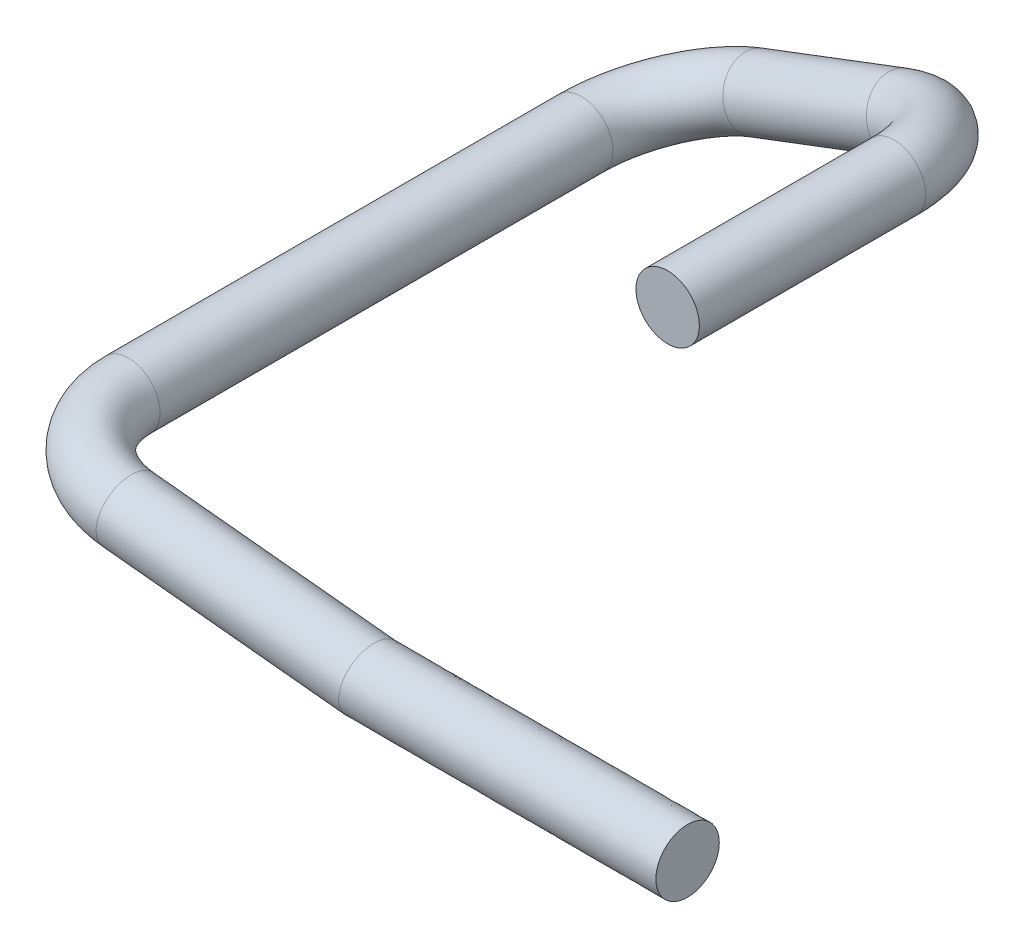
ISO-10303-21;
HEADER;
FILE_DESCRIPTION(('STEP AP214'),'2;1');
FILE_NAME('part.step','',(''),(''),'','','');
FILE_SCHEMA(('AUTOMOTIVE_DESIGN { 1 0 10303 214 1 1 1 1 }'));
ENDSEC;
DATA;
#1=APPLICATION_CONTEXT('core data for automotive mechanical design processes');
#2=APPLICATION_PROTOCOL_DEFINITION('international standard','automotive_design',2000,#1);
#3=PRODUCT_CONTEXT('',#1,'mechanical');
#4=PRODUCT('Part','Part','',(#3));
#5=PRODUCT_RELATED_PRODUCT_CATEGORY('part','',(#4));
#6=PRODUCT_DEFINITION_FORMATION('','',#4);
#7=PRODUCT_DEFINITION_CONTEXT('part definition',#1,'design');
#8=PRODUCT_DEFINITION('design','',#6,#7);
#9=PRODUCT_DEFINITION_SHAPE('','',#8);
#10=(LENGTH_UNIT() NAMED_UNIT(*) SI_UNIT(.MILLI.,.METRE.));
#11=(NAMED_UNIT(*) PLANE_ANGLE_UNIT() SI_UNIT($,.RADIAN.));
#12=(NAMED_UNIT(*) SI_UNIT($,.STERADIAN.) SOLID_ANGLE_UNIT());
#13=UNCERTAINTY_MEASURE_WITH_UNIT(LENGTH_MEASURE(1.E-05),#10,'distance_accuracy_value','');
#14=(GEOMETRIC_REPRESENTATION_CONTEXT(3) GLOBAL_UNCERTAINTY_ASSIGNED_CONTEXT((#13)) GLOBAL_UNIT_ASSIGNED_CONTEXT((#10,
#11,#12)) REPRESENTATION_CONTEXT('',''));
#15=CARTESIAN_POINT('',(0.,0.,0.));
#16=DIRECTION('',(0.,0.,1.));
#17=DIRECTION('',(1.,0.,0.));
#18=AXIS2_PLACEMENT_3D('',#15,#16,#17);
#19=CARTESIAN_POINT('',(6.27851787087894,1.68232379316639,0.));
#20=DIRECTION('',(0.,0.,-1.));
#21=DIRECTION('',(-1.,0.,0.));
#22=AXIS2_PLACEMENT_3D('',#19,#20,#21);
#23=PLANE('',#22);
#24=CARTESIAN_POINT('',(6.27851787087895,1.68232379316639,0.));
#25=DIRECTION('',(0.,0.,1.));
#26=DIRECTION('',(1.,0.,0.));
#27=AXIS2_PLACEMENT_3D('',#24,#25,#26);
#28=CIRCLE('',#27,0.35);
#29=CARTESIAN_POINT('',(6.62851787087895,1.68232379316639,0.));
#30=VERTEX_POINT('',#29);
#31=EDGE_CURVE('E20',#30,#30,#28,.F.);
#32=ORIENTED_EDGE('',*,*,#31,.F.);
#33=EDGE_LOOP('',(#32));
#34=FACE_BOUND('',#33,.T.);
#35=ADVANCED_FACE('F17',(#34),#23,.F.);
#36=CARTESIAN_POINT('',(9.99853230540907,0.505486251141968,3.50000000000001));
#37=DIRECTION('',(-1.,0.,0.));
#38=DIRECTION('',(0.,-1.,0.));
#39=AXIS2_PLACEMENT_3D('',#36,#37,#38);
#40=PLANE('',#39);
#41=CARTESIAN_POINT('',(9.99853230540907,0.,3.15));
#42=CARTESIAN_POINT('',(9.99853230540907,0.0195010104754725,3.14999791433196));
#43=CARTESIAN_POINT('',(9.99853230540907,0.0389894159101418,3.15164876658749));
#44=CARTESIAN_POINT('',(9.99853230540907,0.0774422300209664,3.15820290086756));
#45=CARTESIAN_POINT('',(9.99853230540907,0.0964059788181869,3.16311010061271));
#46=CARTESIAN_POINT('',(9.99853230540907,0.133212037516688,3.17603049641166));
#47=CARTESIAN_POINT('',(9.99853230540907,0.151055878771493,3.18403933880923));
#48=CARTESIAN_POINT('',(9.99853230540907,0.185175285188063,3.20294365652747));
#49=CARTESIAN_POINT('',(9.99853230540907,0.201448634547477,3.21384313131243));
#50=CARTESIAN_POINT('',(9.99853230540907,0.231956555902356,3.23822018103652));
#51=CARTESIAN_POINT('',(9.99853230540907,0.246189327358212,3.25170000860563));
#52=CARTESIAN_POINT('',(9.99853230540907,0.272223156435592,3.2808667429134));
#53=CARTESIAN_POINT('',(9.99853230540907,0.284020737221165,3.29655675222784));
#54=CARTESIAN_POINT('',(9.99853230540907,0.304869666365977,3.32974077120666));
#55=CARTESIAN_POINT('',(9.99853230540907,0.313911505979086,3.34724075421556));
#56=CARTESIAN_POINT('',(9.99853230540907,0.328956835362531,3.38353024989307));
#57=CARTESIAN_POINT('',(9.99853230540907,0.334955983776566,3.40232156191391));
#58=CARTESIAN_POINT('',(9.99853230540907,0.343746415563995,3.44070197741495));
#59=CARTESIAN_POINT('',(9.99853230540907,0.346527605339234,3.46029339267179));
#60=CARTESIAN_POINT('',(9.99853230540907,0.348773563920627,3.49969321275048));
#61=CARTESIAN_POINT('',(9.99853230540907,0.348233633861516,3.5195018854134));
#62=CARTESIAN_POINT('',(9.99853230540907,0.343839242257914,3.55876578864535));
#63=CARTESIAN_POINT('',(9.99853230540907,0.339981878984668,3.57822069456082));
#64=CARTESIAN_POINT('',(9.99853230540907,0.329047095330254,3.61623344745642));
#65=CARTESIAN_POINT('',(9.99853230540907,0.321965176151373,3.63479000093293));
#66=CARTESIAN_POINT('',(9.99853230540907,0.304797141257798,3.67040264474921));
#67=CARTESIAN_POINT('',(9.99853230540907,0.29471822093196,3.68746220353669));
#68=CARTESIAN_POINT('',(9.99853230540907,0.271814642988014,3.71966276067401));
#69=CARTESIAN_POINT('',(9.99853230540907,0.258986210415145,3.73480107528321));
#70=CARTESIAN_POINT('',(9.99853230540907,0.231027521197731,3.76261769462048));
#71=CARTESIAN_POINT('',(9.99853230540907,0.215909633304269,3.77530843157852));
#72=CARTESIAN_POINT('',(9.99853230540907,0.183727247644966,3.79797454247422));
#73=CARTESIAN_POINT('',(9.99853230540907,0.166660097576753,3.80794615259199));
#74=CARTESIAN_POINT('',(9.99853230540907,0.131200303839252,3.82480168401785));
#75=CARTESIAN_POINT('',(9.99853230540907,0.112817009641165,3.83170527823159));
#76=CARTESIAN_POINT('',(9.99853230540907,0.0751186707586158,3.84232599629545));
#77=CARTESIAN_POINT('',(9.99853230540907,0.0558021451634272,3.84603786735628));
#78=CARTESIAN_POINT('',(9.99853230540907,0.0168966899106929,3.85013791053652));
#79=CARTESIAN_POINT('',(9.99853230540907,-0.00269086741801961,3.85053911416046));
#80=CARTESIAN_POINT('',(9.99853230540907,-0.0416216901717497,3.84804250005955));
#81=CARTESIAN_POINT('',(9.99853230540907,-0.0609653084057695,3.8451501807998));
#82=CARTESIAN_POINT('',(9.99853230540907,-0.0988994287046299,3.83615834978499));
#83=CARTESIAN_POINT('',(9.99853230540907,-0.117489655908714,3.83005767866773));
#84=CARTESIAN_POINT('',(9.99853230540907,-0.153359156229602,3.81483688944019));
#85=CARTESIAN_POINT('',(9.99853230540907,-0.170640194787087,3.80572092984624));
#86=CARTESIAN_POINT('',(9.99853230540907,-0.203493672916648,3.78469343540318));
#87=CARTESIAN_POINT('',(9.99853230540907,-0.219059932521825,3.77277224536473));
#88=CARTESIAN_POINT('',(9.99853230540907,-0.247959655139102,3.74651297870794));
#89=CARTESIAN_POINT('',(9.99853230540907,-0.261296105131787,3.73217818781428));
#90=CARTESIAN_POINT('',(9.99853230540907,-0.285465113299815,3.7013976649728));
#91=CARTESIAN_POINT('',(9.99853230540907,-0.296282608325805,3.68494010456854));
#92=CARTESIAN_POINT('',(9.99853230540907,-0.315001598214056,3.65047245372564));
#93=CARTESIAN_POINT('',(9.99853230540907,-0.322907019102577,3.63246449425341));
#94=CARTESIAN_POINT('',(9.99853230540907,-0.335646788695603,3.59526696769232));
#95=CARTESIAN_POINT('',(9.99853230540907,-0.340461636104762,3.57607071950816));
#96=CARTESIAN_POINT('',(9.99853230540907,-0.346804777783299,3.53717028479239));
#97=CARTESIAN_POINT('',(9.99853230540907,-0.348337577458248,3.51746683219775));
#98=CARTESIAN_POINT('',(9.99853230540907,-0.348087670607122,3.4779907356545));
#99=CARTESIAN_POINT('',(9.99853230540907,-0.346289830519648,3.45821818533468));
#100=CARTESIAN_POINT('',(9.99853230540907,-0.339403211064145,3.41928347614775));
#101=CARTESIAN_POINT('',(9.99853230540907,-0.334319055868268,3.40012049924185));
#102=CARTESIAN_POINT('',(9.99853230540907,-0.320994367463433,3.36289283917295));
#103=CARTESIAN_POINT('',(9.99853230540907,-0.31274919691841,3.34482981501579));
#104=CARTESIAN_POINT('',(9.99853230540907,-0.29334632466703,3.31037614739862));
#105=CARTESIAN_POINT('',(9.99853230540907,-0.282192806647442,3.29398314831884));
#106=CARTESIAN_POINT('',(9.99853230540907,-0.257300488296677,3.26333892848638));
#107=CARTESIAN_POINT('',(9.99853230540907,-0.243566023783201,3.24908418679745));
#108=CARTESIAN_POINT('',(9.99853230540907,-0.213908598599903,3.22311674514206));
#109=CARTESIAN_POINT('',(9.99853230540907,-0.197988787289535,3.21140044849749));
#110=CARTESIAN_POINT('',(9.99853230540907,-0.164455384352247,3.19086403069082));
#111=CARTESIAN_POINT('',(9.99853230540907,-0.146848006692196,3.18203377511066));
#112=CARTESIAN_POINT('',(9.99853230540907,-0.110424757137462,3.1674800254597));
#113=CARTESIAN_POINT('',(9.99853230540907,-0.0916104124197628,3.16175268871169));
#114=CARTESIAN_POINT('',(9.99853230540907,-0.0486538318335403,3.15257539870723));
#115=CARTESIAN_POINT('',(9.99853230540907,-0.0243171159599858,3.15000260075916));
#116=CARTESIAN_POINT('',(9.99853230540907,0.,3.15));
#117=B_SPLINE_CURVE_WITH_KNOTS('',3,(#41,#42,#43,#44,#45,#46,#47,#48,#49,#50,#51,#52,#53,#54,
#55,#56,#57,#58,#59,#60,#61,#62,#63,#64,#65,#66,#67,#68,#69,#70,#71,#72,#73,#74,#75,#76,#77,#78,
#79,#80,#81,#82,#83,#84,#85,#86,#87,#88,#89,#90,#91,#92,#93,#94,#95,#96,#97,#98,#99,#100,#101,
#102,#103,#104,#105,#106,#107,#108,#109,#110,#111,#112,#113,#114,#115,#116),.UNSPECIFIED.,.T.,
.F.,(4,2,2,2,2,2,2,2,2,2,2,2,2,2,2,2,2,2,2,2,2,2,2,2,2,2,2,2,2,2,2,2,2,2,2,2,2,4),(0.,
0.0584121419740596,0.116894687478572,0.175295439090735,0.233777419095043,0.292310688235868,
0.350926958678421,0.409743253894557,0.468643234628682,0.527727467176459,0.586895313884669,
0.646114966869097,0.705417495595614,0.764578781111501,0.823821818725464,0.882755518295404,
0.941770384606262,1.00040117089233,1.05912826531801,1.11762408636348,1.1760223928992,
1.23444181661911,1.29278100516718,1.35132400387656,1.409787940819,1.46859299002551,
1.52731846620937,1.58641094491561,1.64542225273589,1.70470235047158,1.76389921626174,
1.82318326061495,1.8823824902868,1.94148314415308,2.00049950363415,2.05930634140796,
2.11804018492194,2.19087819665683),.UNSPECIFIED.);
#118=CARTESIAN_POINT('',(9.99853230540907,0.,3.15));
#119=VERTEX_POINT('',#118);
#120=EDGE_CURVE('E108',#119,#119,#117,.T.);
#121=ORIENTED_EDGE('',*,*,#120,.T.);
#122=EDGE_LOOP('',(#121));
#123=FACE_BOUND('',#122,.T.);
#124=ADVANCED_FACE('F117',(#123),#40,.F.);
#125=CARTESIAN_POINT('',(6.27851787087895,1.68232379316639,-2.49999999999999));
#126=DIRECTION('',(0.,0.,1.));
#127=DIRECTION('',(1.,0.,0.));
#128=AXIS2_PLACEMENT_3D('',#125,#126,#127);
#129=CYLINDRICAL_SURFACE('',#128,0.35);
#130=CARTESIAN_POINT('',(6.27851787087894,1.68232379316638,-2.49999999999999));
#131=DIRECTION('',(0.,0.,1.));
#132=DIRECTION('',(0.934943333045711,0.354797074386721,0.));
#133=AXIS2_PLACEMENT_3D('',#130,#131,#132);
#134=CIRCLE('',#133,0.35);
#135=CARTESIAN_POINT('',(6.60574803744494,1.80650276920173,-2.49999999999999));
#136=VERTEX_POINT('',#135);
#137=EDGE_CURVE('E49',#136,#136,#134,.F.);
#138=ORIENTED_EDGE('',*,*,#137,.F.);
#139=EDGE_LOOP('',(#138));
#140=FACE_BOUND('',#139,.T.);
#141=ORIENTED_EDGE('',*,*,#31,.T.);
#142=EDGE_LOOP('',(#141));
#143=FACE_BOUND('',#142,.T.);
#144=ADVANCED_FACE('F80',(#140,#143),#129,.T.);
#145=CARTESIAN_POINT('',(6.45888659728723,0.,3.15));
#146=CARTESIAN_POINT('',(6.45888659728723,0.348219953026252,3.15));
#147=CARTESIAN_POINT('',(6.45888659728723,0.348219953026251,3.5));
#148=CARTESIAN_POINT('',(6.45888659728723,0.348219953026249,3.85));
#149=CARTESIAN_POINT('',(6.45888659728723,0.,3.85));
#150=CARTESIAN_POINT('',(6.45888659728723,-0.348219953026252,3.85));
#151=CARTESIAN_POINT('',(6.45888659728723,-0.34821995302625,3.5));
#152=CARTESIAN_POINT('',(6.45888659728723,-0.348219953026249,3.15));
#153=CARTESIAN_POINT('',(6.45888659728723,0.,3.15));
#154=CARTESIAN_POINT('',(9.99853230540907,0.,3.15));
#155=CARTESIAN_POINT('',(9.99853230540907,0.348219953026252,3.15));
#156=CARTESIAN_POINT('',(9.99853230540907,0.348219953026251,3.5));
#157=CARTESIAN_POINT('',(9.99853230540907,0.348219953026249,3.85));
#158=CARTESIAN_POINT('',(9.99853230540907,0.,3.85));
#159=CARTESIAN_POINT('',(9.99853230540907,-0.348219953026252,3.85));
#160=CARTESIAN_POINT('',(9.99853230540907,-0.34821995302625,3.5));
#161=CARTESIAN_POINT('',(9.99853230540907,-0.348219953026249,3.15));
#162=CARTESIAN_POINT('',(9.99853230540907,0.,3.15));
#163=(BOUNDED_SURFACE() B_SPLINE_SURFACE(1,2,((#145,#146,#147,#148,#149,#150,#151,#152,#153),
(#154,#155,#156,#157,#158,#159,#160,#161,#162)),.UNSPECIFIED.,.F.,.T.,
.F.) B_SPLINE_SURFACE_WITH_KNOTS((2,2),(3,2,2,2,3),(-0.117466864893625,9.99580658688307),
(-3.14159265358979,-1.5707963267949,0.,1.5707963267949,3.14159265358979),
.UNSPECIFIED.) GEOMETRIC_REPRESENTATION_ITEM() RATIONAL_B_SPLINE_SURFACE(((1.,0.707106781186548,
1.,0.707106781186548,1.,0.707106781186548,1.,0.707106781186548,1.),(1.,0.707106781186548,1.,
0.707106781186548,1.,0.707106781186548,1.,0.707106781186548,1.))) REPRESENTATION_ITEM('') SURFACE());
#164=CARTESIAN_POINT('',(6.49444622487397,-0.0348742834520093,3.8482403169612));
#165=CARTESIAN_POINT('',(6.49404330408124,-0.0388541219113524,3.84783770504731));
#166=CARTESIAN_POINT('',(6.49364326059969,-0.0428272664033785,3.84736608615154));
#167=CARTESIAN_POINT('',(6.49285345788751,-0.0507075029316881,3.84629202577644));
#168=CARTESIAN_POINT('',(6.49246363280135,-0.0546148131588282,3.8456912331521));
#169=CARTESIAN_POINT('',(6.49169426518863,-0.0623548876992178,3.84436518098432));
#170=CARTESIAN_POINT('',(6.49131465487206,-0.0661879494610624,3.84364169657001));
#171=CARTESIAN_POINT('',(6.49056571930915,-0.0737716768734393,3.84207728788206));
#172=CARTESIAN_POINT('',(6.49019632492185,-0.0775227247877977,3.84123824938378));
#173=CARTESIAN_POINT('',(6.4894678218607,-0.084935256893772,3.83945029067292));
#174=CARTESIAN_POINT('',(6.48910864326965,-0.0885972120764176,3.83850335120805));
#175=CARTESIAN_POINT('',(6.48840057240637,-0.0958251103212929,3.83650761057482));
#176=CARTESIAN_POINT('',(6.48805160990127,-0.0993916152414786,3.83546086875023));
#177=CARTESIAN_POINT('',(6.48736397096286,-0.106422911521619,3.83327391188531));
#178=CARTESIAN_POINT('',(6.48702522436651,-0.109888355947777,3.83213581834771));
#179=CARTESIAN_POINT('',(6.4863580180907,-0.11671257323373,3.82977483766443));
#180=CARTESIAN_POINT('',(6.48602948857838,-0.120072089361693,3.82855411768882));
#181=CARTESIAN_POINT('',(6.48538271214233,-0.126680295006514,3.82603673806332));
#182=CARTESIAN_POINT('',(6.48506439601778,-0.12992981425363,3.82474227579719));
#183=CARTESIAN_POINT('',(6.48443805981546,-0.136314454738387,3.82208647004813));
#184=CARTESIAN_POINT('',(6.48412997088304,-0.139450491636978,3.82072733687537));
#185=CARTESIAN_POINT('',(6.48323256527863,-0.14856687326705,3.81661544871469));
#186=CARTESIAN_POINT('',(6.48264702556044,-0.154491817295815,3.81373768214829));
#187=CARTESIAN_POINT('',(6.48151734446983,-0.165855557762162,3.80781346004061));
#188=CARTESIAN_POINT('',(6.48097266813188,-0.17130337734465,3.80478435302283));
#189=CARTESIAN_POINT('',(6.47992466292588,-0.181709598044908,3.79862650547657));
#190=CARTESIAN_POINT('',(6.47942080405443,-0.18667782017591,3.79551445375808));
#191=CARTESIAN_POINT('',(6.47845445290598,-0.19612964864657,3.7892560707095));
#192=CARTESIAN_POINT('',(6.47799142070242,-0.200623628917677,3.78612547736444));
#193=CARTESIAN_POINT('',(6.47710674486019,-0.209139027672339,3.77989017866871));
#194=CARTESIAN_POINT('',(6.47668453526779,-0.213171079112506,3.77680006664436));
#195=CARTESIAN_POINT('',(6.4758815385101,-0.220780048774583,3.77070007327944));
#196=CARTESIAN_POINT('',(6.47550013742316,-0.224367589014097,3.76770351421138));
#197=CARTESIAN_POINT('',(6.47477885344768,-0.231108766191539,3.76183878385618));
#198=CARTESIAN_POINT('',(6.4744382757277,-0.234272764577166,3.75898260069853));
#199=CARTESIAN_POINT('',(6.47379864638797,-0.240190377358536,3.75344057350004));
#200=CARTESIAN_POINT('',(6.47349878980802,-0.242953874797099,3.75076536942742));
#201=CARTESIAN_POINT('',(6.47294104766875,-0.248094982005691,3.74562124134474));
#202=CARTESIAN_POINT('',(6.47268215090863,-0.250481810752017,3.74316163372779));
#203=CARTESIAN_POINT('',(6.47220560223115,-0.254893882269828,3.73847903606384));
#204=CARTESIAN_POINT('',(6.47198678991016,-0.256927531371461,3.73626408548269));
#205=CARTESIAN_POINT('',(6.47159360159858,-0.26065651939394,3.73209589355814));
#206=CARTESIAN_POINT('',(6.47141729632571,-0.262359319923884,3.73014949152338));
#207=CARTESIAN_POINT('',(6.47086075117073,-0.26779336532723,3.72379707781051));
#208=CARTESIAN_POINT('',(6.47049690659546,-0.271438703698146,3.71931555228069));
#209=CARTESIAN_POINT('',(6.46979050115334,-0.278501819055626,3.71017894150804));
#210=CARTESIAN_POINT('',(6.46944792993723,-0.281919706753249,3.70552394245001));
#211=CARTESIAN_POINT('',(6.46878931690261,-0.288516249890193,3.69605737634742));
#212=CARTESIAN_POINT('',(6.46847323067312,-0.291695304847925,3.69124609096836));
#213=CARTESIAN_POINT('',(6.4678662196685,-0.297803720719283,3.68148570532142));
#214=CARTESIAN_POINT('',(6.4675752238893,-0.300733785890771,3.67653705011689));
#215=CARTESIAN_POINT('',(6.46701879620509,-0.306335860133819,3.66652131419393));
#216=CARTESIAN_POINT('',(6.46675326347294,-0.309008887138119,3.66145480843917));
#217=CARTESIAN_POINT('',(6.46624769033725,-0.3140904834346,3.65122338419287));
#218=CARTESIAN_POINT('',(6.46600752148484,-0.316500387579953,3.64605913497064));
#219=CARTESIAN_POINT('',(6.46555273047866,-0.321051385468932,3.63565254184075));
#220=CARTESIAN_POINT('',(6.46533795211899,-0.323194127833463,3.63041092567891));
#221=CARTESIAN_POINT('',(6.46493396256663,-0.327208478315567,3.61986998612409));
#222=CARTESIAN_POINT('',(6.46474456792769,-0.32908203977719,3.61457141358789));
#223=CARTESIAN_POINT('',(6.46439137497898,-0.33255769631629,3.60393676903254));
#224=CARTESIAN_POINT('',(6.46422736612211,-0.334162034846599,3.59860143713143));
#225=CARTESIAN_POINT('',(6.46392497181098,-0.33710082965027,3.58791307234732));
#226=CARTESIAN_POINT('',(6.46378634881604,-0.338437799915611,3.58256073730856));
#227=CARTESIAN_POINT('',(6.4635347527349,-0.340845254816976,3.57185754306137));
#228=CARTESIAN_POINT('',(6.46342151511771,-0.341918500161653,3.56650731091427));
#229=CARTESIAN_POINT('',(6.46322072080094,-0.3438035849906,3.5558266886049));
#230=CARTESIAN_POINT('',(6.4631328724478,-0.344618404630163,3.55049682977406));
#231=CARTESIAN_POINT('',(6.46298287120751,-0.345993251006874,3.5398743446865));
#232=CARTESIAN_POINT('',(6.46292039961309,-0.346556447483584,3.53458213304496));
#233=CARTESIAN_POINT('',(6.46282122770733,-0.347436029072828,3.52405122530778));
#234=CARTESIAN_POINT('',(6.46278418063578,-0.347755741910135,3.51881281023168));
#235=CARTESIAN_POINT('',(6.46273570370053,-0.348157585623121,3.5084030699672));
#236=CARTESIAN_POINT('',(6.46272390906195,-0.348243104585608,3.50323187721529));
#237=CARTESIAN_POINT('',(6.46272665571699,-0.348185924573817,3.49285575637729));
#238=CARTESIAN_POINT('',(6.4627413760014,-0.348041675294551,3.48765083712747));
#239=CARTESIAN_POINT('',(6.46279576619864,-0.34749058646489,3.47661725245139));
#240=CARTESIAN_POINT('',(6.46283826461935,-0.347053817982549,3.47079007365045));
#241=CARTESIAN_POINT('',(6.46294720031667,-0.345890217557908,3.45916072323423));
#242=CARTESIAN_POINT('',(6.46301365509843,-0.345163173466533,3.45335857305311));
#243=CARTESIAN_POINT('',(6.46317149138703,-0.343421681473462,3.44180368244317));
#244=CARTESIAN_POINT('',(6.46326284850542,-0.342407514732073,3.43605089932247));
#245=CARTESIAN_POINT('',(6.46347027831301,-0.340097121745249,3.42461882964435));
#246=CARTESIAN_POINT('',(6.46358628382698,-0.338801661912365,3.41893938695949));
#247=CARTESIAN_POINT('',(6.46384312242197,-0.335936634957036,3.40767729252196));
#248=CARTESIAN_POINT('',(6.46398384384672,-0.334368300854617,3.4020943245372));
#249=CARTESIAN_POINT('',(6.46429014153389,-0.330967949854621,3.39104736342589));
#250=CARTESIAN_POINT('',(6.46445556054605,-0.329137604032101,3.38558285153152));
#251=CARTESIAN_POINT('',(6.46481130528253,-0.325225937178745,3.37479355005252));
#252=CARTESIAN_POINT('',(6.46500142639716,-0.32314668789148,3.36946800255382));
#253=CARTESIAN_POINT('',(6.46540662324777,-0.318751968975719,3.35897566370815));
#254=CARTESIAN_POINT('',(6.46562144518667,-0.316438926940074,3.35380784567677));
#255=CARTESIAN_POINT('',(6.46607609430119,-0.311593150866111,3.34364805239052));
#256=CARTESIAN_POINT('',(6.4663156164329,-0.309063149662563,3.33865475992548));
#257=CARTESIAN_POINT('',(6.46681972200995,-0.30380145573578,3.32885897628291));
#258=CARTESIAN_POINT('',(6.46708394691431,-0.301072746476963,3.32405486396466));
#259=CARTESIAN_POINT('',(6.46763750315832,-0.29543278878187,3.31465014296044));
#260=CARTESIAN_POINT('',(6.46792642031342,-0.292524717674671,3.3100476042825));
#261=CARTESIAN_POINT('',(6.46852945759423,-0.28654601917069,3.30105640926891));
#262=CARTESIAN_POINT('',(6.46884310474213,-0.283478705745998,3.29666551732676));
#263=CARTESIAN_POINT('',(6.46949552231221,-0.27720199703171,3.28810563697206));
#264=CARTESIAN_POINT('',(6.46983376149408,-0.273995996658147,3.28393411848498));
#265=CARTESIAN_POINT('',(6.4705359358735,-0.267462629938139,3.27581873701066));
#266=CARTESIAN_POINT('',(6.47089926733139,-0.264138685374942,3.27187206644446));
#267=CARTESIAN_POINT('',(6.47164984263334,-0.257389879992538,3.264209733942));
#268=CARTESIAN_POINT('',(6.47203645390882,-0.253968421814703,3.2604910136538));
#269=CARTESIAN_POINT('',(6.47284034951535,-0.24704529875843,3.25328639688814));
#270=CARTESIAN_POINT('',(6.4732567915074,-0.243546959886501,3.2497972073012));
#271=CARTESIAN_POINT('',(6.47418319300714,-0.23575679215381,3.2423504415965));
#272=CARTESIAN_POINT('',(6.47469638449953,-0.231436377327916,3.23842311189031));
#273=CARTESIAN_POINT('',(6.47571638371396,-0.22261293678146,3.23079811235202));
#274=CARTESIAN_POINT('',(6.47622320266347,-0.218110317631181,3.22709997327341));
#275=CARTESIAN_POINT('',(6.4772381541058,-0.208940944956449,3.21994620355311));
#276=CARTESIAN_POINT('',(6.47774627650297,-0.204274792122588,3.21648980166339));
#277=CARTESIAN_POINT('',(6.47876178282237,-0.194797340264732,3.2098299201611));
#278=CARTESIAN_POINT('',(6.47926915951838,-0.189986801481084,3.20662535750489));
#279=CARTESIAN_POINT('',(6.48028372884361,-0.180240481212064,3.20047765742857));
#280=CARTESIAN_POINT('',(6.480790905685,-0.175305581190253,3.19753311994289));
#281=CARTESIAN_POINT('',(6.48180493635955,-0.165330918376763,3.19191184026479));
#282=CARTESIAN_POINT('',(6.48231176804892,-0.160292119931256,3.18923338281187));
#283=CARTESIAN_POINT('',(6.4833251555774,-0.150130299414553,3.18414852827697));
#284=CARTESIAN_POINT('',(6.4838316805798,-0.145008286340474,3.18174010849748));
#285=CARTESIAN_POINT('',(6.48484445383953,-0.134700663987419,3.17719750035078));
#286=CARTESIAN_POINT('',(6.48535066187014,-0.129516071583495,3.17506099543492));
#287=CARTESIAN_POINT('',(6.48636281425746,-0.119103662983783,3.17106235631376));
#288=CARTESIAN_POINT('',(6.48686870796474,-0.113876837029745,3.1691976304354));
#289=CARTESIAN_POINT('',(6.4878802421262,-0.103399848586225,3.16574074814143));
#290=CARTESIAN_POINT('',(6.48838582076229,-0.0981506182542486,3.16414574810222));
#291=CARTESIAN_POINT('',(6.48939673674847,-0.0876480159437851,3.16122469681345));
#292=CARTESIAN_POINT('',(6.48990200046977,-0.0823954902397165,3.159895576775));
#293=CARTESIAN_POINT('',(6.49091229890945,-0.0719046175531877,3.15750098874013));
#294=CARTESIAN_POINT('',(6.49141724770459,-0.0666670072447185,3.15643225632461));
#295=CARTESIAN_POINT('',(6.49242692879874,-0.0562232566270069,3.15455163657834));
#296=CARTESIAN_POINT('',(6.49293156254039,-0.0510177240090194,3.15373632053523));
#297=CARTESIAN_POINT('',(6.4939406269575,-0.0406542659396442,3.15235438021843));
#298=CARTESIAN_POINT('',(6.49444494622892,-0.0354968042268095,3.15178419542178));
#299=CARTESIAN_POINT('',(6.49545339258936,-0.0252443729930762,3.15088324420654));
#300=CARTESIAN_POINT('',(6.49595739539869,-0.0201497126694305,3.15054881744106));
#301=CARTESIAN_POINT('',(6.49696522927962,-0.0100364558021707,3.15010901856074));
#302=CARTESIAN_POINT('',(6.49746892309382,-0.00501800738300937,3.14999992020655));
#303=CARTESIAN_POINT('',(6.49797694668167,0.,3.15));
#304=B_SPLINE_CURVE_WITH_KNOTS('',3,(#164,#165,#166,#167,#168,#169,#170,#171,#172,#173,#174,
#175,#176,#177,#178,#179,#180,#181,#182,#183,#184,#185,#186,#187,#188,#189,#190,#191,#192,#193,
#194,#195,#196,#197,#198,#199,#200,#201,#202,#203,#204,#205,#206,#207,#208,#209,#210,#211,#212,
#213,#214,#215,#216,#217,#218,#219,#220,#221,#222,#223,#224,#225,#226,#227,#228,#229,#230,#231,
#232,#233,#234,#235,#236,#237,#238,#239,#240,#241,#242,#243,#244,#245,#246,#247,#248,#249,#250,
#251,#252,#253,#254,#255,#256,#257,#258,#259,#260,#261,#262,#263,#264,#265,#266,#267,#268,#269,
#270,#271,#272,#273,#274,#275,#276,#277,#278,#279,#280,#281,#282,#283,#284,#285,#286,#287,#288,
#289,#290,#291,#292,#293,#294,#295,#296,#297,#298,#299,#300,#301,#302,#303),.UNSPECIFIED.,.F.,
.F.,(4,2,2,2,2,2,2,2,2,2,2,2,2,2,2,2,2,2,2,2,2,2,2,2,2,2,2,2,2,2,2,2,2,2,2,2,2,2,2,2,2,2,2,2,2,
2,2,2,2,2,2,2,2,2,2,2,2,2,2,2,2,2,2,2,2,2,2,2,2,4),(0.,0.0120605701828652,0.0239754744121691,
0.0357307702832373,0.0473130030180738,0.058709255605532,0.0699071918649155,0.0808950921770543,
0.0916618817735167,0.10219715161438,0.112491172014331,0.13231798803386,0.151080463504615,
0.168725070979299,0.18520833243882,0.200495979021972,0.214561943121326,0.22738725475753,
0.238958905127227,0.249268729368718,0.258312349694931,0.266088210833708,0.283445362180716,
0.300794002229253,0.318112943661319,0.33538114462871,0.352577869969258,0.369682847021011,
0.386676413241185,0.403539653104752,0.420254522106599,0.436803956102855,0.453171964680397,
0.469343707716348,0.485305554759925,0.501045127317295,0.516555761264318,0.53217149348961,
0.549695087120715,0.567231511452504,0.584750822564298,0.602222986385317,0.619618158382321,
0.636906958306399,0.654060733739766,0.671051806684442,0.687853698169442,0.704441326771669,
0.72079117798795,0.736881442497825,0.752692122455694,0.768205105990563,0.783404211025162,
0.798275200319544,0.815851166445572,0.833389869991349,0.850869790917456,0.868269877929308,
0.885569695804801,0.902749561138094,0.919790664479576,0.936675177293763,0.95338634262292,
0.969908548813179,0.986227386112185,1.0023296863661,1.01820354641605,1.03383833611037,
1.04922469210394,1.06435449880786),.UNSPECIFIED.);
#305=CARTESIAN_POINT('',(6.49797694668244,1.14556763698328E-11,3.15000001977347));
#306=VERTEX_POINT('',#305);
#307=CARTESIAN_POINT('',(6.49444632870054,-0.0348732579183856,3.84823013559081));
#308=VERTEX_POINT('',#307);
#309=EDGE_CURVE('E41',#306,#308,#304,.F.);
#310=CARTESIAN_POINT('',(6.49797694668167,0.,3.15));
#311=CARTESIAN_POINT('',(6.49848839982498,0.00459482311331575,3.14999994499258));
#312=CARTESIAN_POINT('',(6.49899552393397,0.00919012253459379,3.15009140744168));
#313=CARTESIAN_POINT('',(6.4999950393003,0.0183140429244714,3.15045468339084));
#314=CARTESIAN_POINT('',(6.50048753657046,0.022842747276401,3.15072411348824));
#315=CARTESIAN_POINT('',(6.50145780025447,0.0318191203663033,3.15143531793075));
#316=CARTESIAN_POINT('',(6.50193567681992,0.0362669866813344,3.15187444979058));
#317=CARTESIAN_POINT('',(6.50287669448433,0.0450682871101353,3.15291567396213));
#318=CARTESIAN_POINT('',(6.50333994818498,0.0494220491116678,3.15351489428382));
#319=CARTESIAN_POINT('',(6.50425171932616,0.058022827269559,3.15486579040731));
#320=CARTESIAN_POINT('',(6.50470035018901,0.0622703138638314,3.15561439568395));
#321=CARTESIAN_POINT('',(6.50558287567253,0.0706474110654796,3.15725257385999));
#322=CARTESIAN_POINT('',(6.50601688316907,0.0747776427511132,3.15813891108086));
#323=CARTESIAN_POINT('',(6.50687016326544,0.0829103550792865,3.16004026383672));
#324=CARTESIAN_POINT('',(6.50728954703624,0.0869136113594586,3.16105191288287));
#325=CARTESIAN_POINT('',(6.50811358193444,0.0947837968553651,3.16319097460469));
#326=CARTESIAN_POINT('',(6.5085183415946,0.0986516561201656,3.16431492459583));
#327=CARTESIAN_POINT('',(6.50931313130814,0.106243787843516,3.16666522586755));
#328=CARTESIAN_POINT('',(6.50970326653771,0.109969140778583,3.1678880523105));
#329=CARTESIAN_POINT('',(6.51046881084706,0.117270306745791,3.17042246747005));
#330=CARTESIAN_POINT('',(6.51084432124219,0.120847343249764,3.17173050200513));
#331=CARTESIAN_POINT('',(6.51158062007655,0.127847202474914,3.1744215831998));
#332=CARTESIAN_POINT('',(6.51194150565154,0.131271381060667,3.17580107722099));
#333=CARTESIAN_POINT('',(6.51264855776551,0.137962062946614,3.17862135797936));
#334=CARTESIAN_POINT('',(6.51299481718894,0.141230041806799,3.1800586224791));
#335=CARTESIAN_POINT('',(6.51367262495005,0.147606058820802,3.18298092494795));
#336=CARTESIAN_POINT('',(6.51400426181074,0.150715675713844,3.1844624961826));
#337=CARTESIAN_POINT('',(6.5146528143068,0.15677362880104,3.18746009869843));
#338=CARTESIAN_POINT('',(6.51496981498251,0.159723635575194,3.18897274508527));
#339=CARTESIAN_POINT('',(6.51587952731638,0.168153248289455,3.19344858799713));
#340=CARTESIAN_POINT('',(6.516469672881,0.173577185830838,3.19651813557891));
#341=CARTESIAN_POINT('',(6.51759087419874,0.183779874475994,3.20265968397335));
#342=CARTESIAN_POINT('',(6.51812253521455,0.188573228936388,3.20570740194149));
#343=CARTESIAN_POINT('',(6.5191268231463,0.197533734750209,3.2117175310758));
#344=CARTESIAN_POINT('',(6.51960003483206,0.20171555859851,3.21465797324786));
#345=CARTESIAN_POINT('',(6.52048743366546,0.209478910761136,3.22037618922841));
#346=CARTESIAN_POINT('',(6.52090222312105,0.213074694497122,3.22313453651907));
#347=CARTESIAN_POINT('',(6.5216726280486,0.219696313382741,3.22842229758171));
#348=CARTESIAN_POINT('',(6.52202893046466,0.222735505102945,3.23093489946658));
#349=CARTESIAN_POINT('',(6.52268254594028,0.228275739985266,3.23567567108291));
#350=CARTESIAN_POINT('',(6.52298065613618,0.23078885469003,3.23788963492196));
#351=CARTESIAN_POINT('',(6.52351680628205,0.235307945652316,3.24198788289431));
#352=CARTESIAN_POINT('',(6.52375607148093,0.237324382491825,3.24386048463033));
#353=CARTESIAN_POINT('',(6.524176618353,0.240878215366617,3.24723998671359));
#354=CARTESIAN_POINT('',(6.52435917301236,0.242424242659034,3.2487376496804));
#355=CARTESIAN_POINT('',(6.52465927877854,0.245061575277586,3.25134020943127));
#356=CARTESIAN_POINT('',(6.52478075372031,0.246159382485595,3.25243808534129));
#357=CARTESIAN_POINT('',(6.52534557540667,0.251347273865129,3.25769604497468));
#358=CARTESIAN_POINT('',(6.52575303278537,0.255342993244453,3.26195403164424));
#359=CARTESIAN_POINT('',(6.52655412260701,0.263124593392544,3.27067446669714));
#360=CARTESIAN_POINT('',(6.52694772404458,0.266910013310633,3.27513732778602));
#361=CARTESIAN_POINT('',(6.52770450623651,0.274256593411537,3.28425295034984));
#362=CARTESIAN_POINT('',(6.52806766069132,0.277817559069269,3.2889058709396));
#363=CARTESIAN_POINT('',(6.52876796905404,0.284700851867971,3.29838392002147));
#364=CARTESIAN_POINT('',(6.52910513351423,0.288023275822021,3.30320897744734));
#365=CARTESIAN_POINT('',(6.52975223280404,0.29441735762511,3.31301271664409));
#366=CARTESIAN_POINT('',(6.53006221224678,0.297489425721633,3.31799112788582));
#367=CARTESIAN_POINT('',(6.53065522948619,0.303372522753885,3.32808179899968));
#368=CARTESIAN_POINT('',(6.53093834366766,0.306184291195281,3.33319362326226));
#369=CARTESIAN_POINT('',(6.5314775129125,0.311538625746496,3.34353055924902));
#370=CARTESIAN_POINT('',(6.53173367629631,0.314082269585933,3.3487551071044));
#371=CARTESIAN_POINT('',(6.53221893559344,0.318894330900797,3.35929637674027));
#372=CARTESIAN_POINT('',(6.53244817079872,0.321164166516154,3.36461244477685));
#373=CARTESIAN_POINT('',(6.53287953678493,0.325424763536053,3.37531537527297));
#374=CARTESIAN_POINT('',(6.53308183751924,0.327417278816338,3.38070153276343));
#375=CARTESIAN_POINT('',(6.53345930567894,0.33112154617082,3.39152326643862));
#376=CARTESIAN_POINT('',(6.53363467336687,0.332835376665056,3.39695812427422));
#377=CARTESIAN_POINT('',(6.53395824427089,0.33598269137133,3.40785614957923));
#378=CARTESIAN_POINT('',(6.53410667790168,0.337418561326505,3.41331862130676));
#379=CARTESIAN_POINT('',(6.5343763513888,0.34001238803023,3.42425127753899));
#380=CARTESIAN_POINT('',(6.53449785173821,0.341173015286863,3.42972082213757));
#381=CARTESIAN_POINT('',(6.53471362432689,0.34322068469252,3.44064776305292));
#382=CARTESIAN_POINT('',(6.53480818723397,0.344110655043779,3.44610460502522));
#383=CARTESIAN_POINT('',(6.53497006809395,0.345623085858655,3.45698721440914));
#384=CARTESIAN_POINT('',(6.53503770680339,0.346248701557698,3.4624125386791));
#385=CARTESIAN_POINT('',(6.53514565761757,0.347240076736028,3.4732142858582));
#386=CARTESIAN_POINT('',(6.53518632157516,0.347609185197525,3.47859039807218));
#387=CARTESIAN_POINT('',(6.53524047726999,0.348096592749398,3.48927714704459));
#388=CARTESIAN_POINT('',(6.53525434889854,0.348218399645633,3.49458762194843));
#389=CARTESIAN_POINT('',(6.53525421140243,0.348221439361378,3.50507904887644));
#390=CARTESIAN_POINT('',(6.53524087419742,0.348108468702401,3.5102600001487));
#391=CARTESIAN_POINT('',(6.53518793501505,0.347649856062546,3.52070175671993));
#392=CARTESIAN_POINT('',(6.53514788034924,0.347300202291505,3.52596238398598));
#393=CARTESIAN_POINT('',(6.53504165281146,0.346357152526038,3.53654898222397));
#394=CARTESIAN_POINT('',(6.53497505994941,0.345759830497302,3.54187459940328));
#395=CARTESIAN_POINT('',(6.53481567885917,0.344311391252273,3.55257521332216));
#396=CARTESIAN_POINT('',(6.5347224992929,0.343456470955803,3.55794968967254));
#397=CARTESIAN_POINT('',(6.53450992934327,0.341484007571594,3.56873065294677));
#398=CARTESIAN_POINT('',(6.53439017705583,0.340362821649906,3.57413646644137));
#399=CARTESIAN_POINT('',(6.53412442964251,0.337850431114521,3.58496144296179));
#400=CARTESIAN_POINT('',(6.53397810158348,0.336455780586534,3.59037979822964));
#401=CARTESIAN_POINT('',(6.53365917471065,0.3333906944883,3.60121004233593));
#402=CARTESIAN_POINT('',(6.5334862718263,0.33171704496837,3.60662101280149));
#403=CARTESIAN_POINT('',(6.53311416868114,0.328090007558795,3.61741569022484));
#404=CARTESIAN_POINT('',(6.53291469312617,0.326133670045511,3.62279839676292));
#405=CARTESIAN_POINT('',(6.53248940881204,0.32193928015358,3.6335149726519));
#406=CARTESIAN_POINT('',(6.53226335343078,0.319698571104373,3.63884779254182));
#407=CARTESIAN_POINT('',(6.53178490946858,0.314935572022612,3.64944248272041));
#408=CARTESIAN_POINT('',(6.53153230338558,0.312410942111833,3.65470329137897));
#409=CARTESIAN_POINT('',(6.53100062125922,0.30708245973929,3.66513155792429));
#410=CARTESIAN_POINT('',(6.53072135595006,0.304276602434717,3.67029798181905));
#411=CARTESIAN_POINT('',(6.53013673370978,0.298390274628549,3.68051510959948));
#412=CARTESIAN_POINT('',(6.52983121974834,0.295308145812479,3.68556484925408));
#413=CARTESIAN_POINT('',(6.52919253449233,0.288876308559602,3.69552641494118));
#414=CARTESIAN_POINT('',(6.52885922781014,0.285525293679517,3.70043738859544));
#415=CARTESIAN_POINT('',(6.52817070307937,0.278564559644339,3.71010027206087));
#416=CARTESIAN_POINT('',(6.52781540453853,0.274953881216772,3.71485148572811));
#417=CARTESIAN_POINT('',(6.52706118003544,0.267486580924933,3.72417291020574));
#418=CARTESIAN_POINT('',(6.52666214267666,0.263629342020288,3.72874261648277));
#419=CARTESIAN_POINT('',(6.52590165136504,0.255677540843161,3.73768657691021));
#420=CARTESIAN_POINT('',(6.52554024726473,0.251582674687872,3.74206056753355));
#421=CARTESIAN_POINT('',(6.52500913185996,0.247075628040117,3.74663356814247));
#422=CARTESIAN_POINT('',(6.52497181238379,0.246764562867106,3.74694798521585));
#423=CARTESIAN_POINT('',(6.52483337232923,0.245613460361062,3.74810708008175));
#424=CARTESIAN_POINT('',(6.52473123864527,0.244769758801077,3.74894799058299));
#425=CARTESIAN_POINT('',(6.52423221784676,0.240627568093115,3.75303441458207));
#426=CARTESIAN_POINT('',(6.52383493983398,0.237268442574235,3.75621902511411));
#427=CARTESIAN_POINT('',(6.52314170207305,0.23130926656411,3.76164761660835));
#428=CARTESIAN_POINT('',(6.52284604726826,0.228736977579386,3.76392229523329));
#429=CARTESIAN_POINT('',(6.5221903153028,0.222963436088061,3.76887783981277));
#430=CARTESIAN_POINT('',(6.52183011880134,0.219746354022909,3.77154029827292));
#431=CARTESIAN_POINT('',(6.52104529756548,0.21264429140882,3.77720604439724));
#432=CARTESIAN_POINT('',(6.5206204885004,0.208741395121066,3.78018686872176));
#433=CARTESIAN_POINT('',(6.51970655440937,0.200229069913727,3.78640763589352));
#434=CARTESIAN_POINT('',(6.51921717532033,0.195600269027151,3.78962104593181));
#435=CARTESIAN_POINT('',(6.51817416449022,0.18560180550657,3.79620830308969));
#436=CARTESIAN_POINT('',(6.51762017376155,0.180212047057514,3.79955170750027));
#437=CARTESIAN_POINT('',(6.51676350111275,0.171774399731239,3.80447161723231));
#438=CARTESIAN_POINT('',(6.51646224989618,0.168787782246169,3.80615440265415));
#439=CARTESIAN_POINT('',(6.5158436544845,0.16261917923143,3.80951085525639));
#440=CARTESIAN_POINT('',(6.51552624228684,0.159434771636169,3.81118007101578));
#441=CARTESIAN_POINT('',(6.51487534602637,0.152870288991137,3.81449225936494));
#442=CARTESIAN_POINT('',(6.51454178591536,0.149487889647807,3.81613060868734));
#443=CARTESIAN_POINT('',(6.51385859969675,0.142528347696917,3.81936329698312));
#444=CARTESIAN_POINT('',(6.51350888851872,0.138949002166336,3.8209528777387));
#445=CARTESIAN_POINT('',(6.51279341055722,0.131598070455821,3.82406965040915));
#446=CARTESIAN_POINT('',(6.51242754985561,0.127824433708444,3.82559198576786));
#447=CARTESIAN_POINT('',(6.51167978180126,0.120089100274702,3.82855550198555));
#448=CARTESIAN_POINT('',(6.51129777182163,0.116125531357906,3.82999177175357));
#449=CARTESIAN_POINT('',(6.51051771411748,0.108016337601754,3.83276421318311));
#450=CARTESIAN_POINT('',(6.51011955551876,0.103869041766978,3.83409546775895));
#451=CARTESIAN_POINT('',(6.50930720867644,0.0954003170857735,3.83663900845592));
#452=CARTESIAN_POINT('',(6.50889290204083,0.0910774363990491,3.83784642460906));
#453=CARTESIAN_POINT('',(6.50804826624973,0.0822674482659643,3.84012376308979));
#454=CARTESIAN_POINT('',(6.50761781223349,0.0777791202543039,3.84118891910973));
#455=CARTESIAN_POINT('',(6.50674088739702,0.0686501471708655,3.84316384915076));
#456=CARTESIAN_POINT('',(6.5062942866319,0.0640085181775334,3.84406901928179));
#457=CARTESIAN_POINT('',(6.50538507247332,0.0545868288851236,3.84570702624741));
#458=CARTESIAN_POINT('',(6.50492232579673,0.0498060192449723,3.84643548096192));
#459=CARTESIAN_POINT('',(6.50398082123654,0.0401217521874682,3.84770435743887));
#460=CARTESIAN_POINT('',(6.50350192882428,0.0352177701041076,3.84824067736204));
#461=CARTESIAN_POINT('',(6.50252813432811,0.0253047061904707,3.84911109376518));
#462=CARTESIAN_POINT('',(6.50203309899135,0.0202953064905601,3.84944142351959));
#463=CARTESIAN_POINT('',(6.50102700749876,0.0101905423653798,3.84988760737792));
#464=CARTESIAN_POINT('',(6.50051582203265,0.00509504143279098,3.85000008245253));
#465=CARTESIAN_POINT('',(6.5,0.,3.85));
#466=B_SPLINE_CURVE_WITH_KNOTS('',3,(#310,#311,#312,#313,#314,#315,#316,#317,#318,#319,#320,
#321,#322,#323,#324,#325,#326,#327,#328,#329,#330,#331,#332,#333,#334,#335,#336,#337,#338,#339,
#340,#341,#342,#343,#344,#345,#346,#347,#348,#349,#350,#351,#352,#353,#354,#355,#356,#357,#358,
#359,#360,#361,#362,#363,#364,#365,#366,#367,#368,#369,#370,#371,#372,#373,#374,#375,#376,#377,
#378,#379,#380,#381,#382,#383,#384,#385,#386,#387,#388,#389,#390,#391,#392,#393,#394,#395,#396,
#397,#398,#399,#400,#401,#402,#403,#404,#405,#406,#407,#408,#409,#410,#411,#412,#413,#414,#415,
#416,#417,#418,#419,#420,#421,#422,#423,#424,#425,#426,#427,#428,#429,#430,#431,#432,#433,#434,
#435,#436,#437,#438,#439,#440,#441,#442,#443,#444,#445,#446,#447,#448,#449,#450,#451,#452,#453,
#454,#455,#456,#457,#458,#459,#460,#461,#462,#463,#464,#465),.UNSPECIFIED.,.F.,.F.,(4,2,2,2,2,2,
2,2,2,2,2,2,2,2,2,2,2,2,2,2,2,2,2,2,2,2,2,2,2,2,2,2,2,2,2,2,2,2,2,2,2,2,2,2,2,2,2,2,2,2,2,2,2,2,
2,2,2,2,2,2,2,2,2,2,2,2,2,2,2,2,2,2,2,2,2,2,2,4),(0.,0.0138686812884602,0.0275552952102018,
0.0410368602724279,0.0542911527386888,0.0672968270918717,0.0800335200623843,0.0924819371282969,
0.104623920888001,0.116442501184958,0.127921927310211,0.139047683006781,0.149806485340047,
0.160186268772897,0.170176155990868,0.188946739951205,0.20605529273112,0.221452256300265,
0.235101363623881,0.246977284792751,0.257063318859531,0.265349250806424,0.27182946083957,
0.276501355015419,0.294053029536706,0.311641761461934,0.329245532955366,0.346842119023075,
0.364409264899459,0.381924864271511,0.399367134921238,0.416714788442102,0.433947190882589,
0.451044511478109,0.467987857034681,0.484759390002133,0.501342428795979,0.517721529469293,
0.533882548373093,0.549812685952811,0.565354193830147,0.581165954911566,0.597238574700546,
0.61356119198818,0.630121486065567,0.646905689384918,0.663898619338178,0.681083730153856,
0.698443185446274,0.715957951418669,0.733607910141689,0.751371991725641,0.769228323606119,
0.787154394598211,0.805127230873713,0.823123580606172,0.824455159210411,0.828041850381229,
0.841974819597331,0.852312996482336,0.864884516369507,0.879668138110051,0.896629988023504,
0.915719645529963,0.926042246056528,0.936868529840122,0.948185797353079,0.959979618561772,
0.972233755542887,0.984930105928411,0.998048670821055,1.01156755053105,1.02546297101836,
1.03970934327812,1.05427935708977,1.06914410958304,1.08427326799039,1.09963526480324),.UNSPECIFIED.);
#467=CARTESIAN_POINT('',(6.5,0.,3.85));
#468=VERTEX_POINT('',#467);
#469=EDGE_CURVE('E44',#468,#306,#466,.F.);
#470=CARTESIAN_POINT('',(6.49798720945842,0.00010136937220271,3.84999998516989));
#471=CARTESIAN_POINT('',(6.49807107573097,9.71456482416063E-05,3.84999998640574));
#472=CARTESIAN_POINT('',(6.49815494200353,9.29219243029046E-05,3.84999998756434));
#473=CARTESIAN_POINT('',(6.49832267454865,8.4474476464659E-05,3.84999998972706));
#474=CARTESIAN_POINT('',(6.49840654082121,8.02507525651151E-05,3.84999999073118));
#475=CARTESIAN_POINT('',(6.49857427336633,7.18033047994851E-05,3.84999999258495));
#476=CARTESIAN_POINT('',(6.49865813963889,6.7579580933399E-05,3.84999999343459));
#477=CARTESIAN_POINT('',(6.49882587218402,5.91321332292783E-05,3.84999999497939));
#478=CARTESIAN_POINT('',(6.49890973845659,5.49084093912436E-05,3.84999999567455));
#479=CARTESIAN_POINT('',(6.49907747100172,4.64609617375619E-05,3.84999999691039));
#480=CARTESIAN_POINT('',(6.49916133727429,4.22372379219148E-05,3.84999999745108));
#481=CARTESIAN_POINT('',(6.49932906981943,3.37897903073514E-05,3.84999999837796));
#482=CARTESIAN_POINT('',(6.499412936092,2.95660665084352E-05,3.84999999876416));
#483=CARTESIAN_POINT('',(6.49958066863714,2.11186189217975E-05,3.84999999938208));
#484=CARTESIAN_POINT('',(6.49966453490971,1.68948951340761E-05,3.8499999996138));
#485=CARTESIAN_POINT('',(6.49983226745486,8.44744756423509E-06,3.84999999992276));
#486=CARTESIAN_POINT('',(6.49991613372743,4.22372378211542E-06,3.85));
#487=CARTESIAN_POINT('',(6.5,0.,3.85));
#488=B_SPLINE_CURVE_WITH_KNOTS('',3,(#470,#471,#472,#473,#474,#475,#476,#477,#478,#479,#480,
#481,#482,#483,#484,#485,#486,#487),.UNSPECIFIED.,.F.,.F.,(4,2,2,2,2,2,2,2,4),(0.,
0.000251917692232358,0.000503835384463235,0.000755753076694336,0.00100767076892561,
0.00125958846115703,0.00151150615338855,0.00176342384562015,0.00201534153785179),.UNSPECIFIED.);
#489=CARTESIAN_POINT('',(6.49798720945305,0.000101369320144709,3.84999998516991));
#490=VERTEX_POINT('',#489);
#491=EDGE_CURVE('E35',#490,#468,#488,.T.);
#492=CARTESIAN_POINT('',(6.49798720945842,0.000101369372249713,3.84999998516989));
#493=CARTESIAN_POINT('',(6.49783929679028,-0.00133337698374399,3.85000040549921));
#494=CARTESIAN_POINT('',(6.4976917583797,-0.00276816458226775,3.84999191224552));
#495=CARTESIAN_POINT('',(6.49739667792161,-0.00564477829694147,3.8499570123091));
#496=CARTESIAN_POINT('',(6.49724913955046,-0.00708660370569678,3.84993051619773));
#497=CARTESIAN_POINT('',(6.49695405931504,-0.00997701387855903,3.84985934411433));
#498=CARTESIAN_POINT('',(6.49680652104099,-0.0114255968120812,3.84981457889412));
#499=CARTESIAN_POINT('',(6.49651144096369,-0.0143292293699135,3.84970660745909));
#500=CARTESIAN_POINT('',(6.49636390265904,-0.0157842760424709,3.84964331228995));
#501=CARTESIAN_POINT('',(6.49606882264513,-0.0187005340523296,3.84949802450097));
#502=CARTESIAN_POINT('',(6.49592128434323,-0.0201617413207565,3.8494159432798));
#503=CARTESIAN_POINT('',(6.49562620442088,-0.0230900091646659,3.84923283231507));
#504=CARTESIAN_POINT('',(6.49547866611605,-0.0245570645602192,3.84913171438484));
#505=CARTESIAN_POINT('',(6.49518358626809,-0.0274967080068081,3.84891028430477));
#506=CARTESIAN_POINT('',(6.49503604794859,-0.0289692897749828,3.84878988444364));
#507=CARTESIAN_POINT('',(6.49474096821549,-0.0319196561933231,3.84852965167709));
#508=CARTESIAN_POINT('',(6.49459342993363,-0.0333974334684919,3.84838973160244));
#509=CARTESIAN_POINT('',(6.49444622487397,-0.0348742834520093,3.8482403169612));
#510=B_SPLINE_CURVE_WITH_KNOTS('',3,(#492,#493,#494,#495,#496,#497,#498,#499,#500,#501,#502,
#503,#504,#505,#506,#507,#508,#509),.UNSPECIFIED.,.F.,.F.,(4,2,2,2,2,2,2,2,4),(0.,
0.0043270245516162,0.00867570214429862,0.0130458831383876,0.0174373974898005,0.0218500668311543,
0.0262837044009606,0.0307381149785018,0.0352130948246603),.UNSPECIFIED.);
#511=EDGE_CURVE('E53',#308,#490,#510,.F.);
#512=ORIENTED_EDGE('',*,*,#120,.F.);
#513=EDGE_LOOP('',(#512));
#514=FACE_BOUND('',#513,.T.);
#515=ORIENTED_EDGE('',*,*,#309,.F.);
#516=ORIENTED_EDGE('',*,*,#469,.F.);
#517=ORIENTED_EDGE('',*,*,#491,.F.);
#518=ORIENTED_EDGE('',*,*,#511,.F.);
#519=EDGE_LOOP('',(#515,#516,#517,#518));
#520=FACE_BOUND('',#519,.T.);
#521=ADVANCED_FACE('F46',(#514,#520),#163,.F.);
#522=CARTESIAN_POINT('',(5.34357453783323,1.32752671877966,-2.5));
#523=DIRECTION('',(0.354797074386721,-0.934943333045711,0.));
#524=DIRECTION('',(0.,0.,-1.));
#525=AXIS2_PLACEMENT_3D('',#522,#523,#524);
#526=TOROIDAL_SURFACE('',#525,1.,0.35);
#527=CARTESIAN_POINT('',(5.34357453783324,1.32752671877967,-3.5));
#528=DIRECTION('',(0.934943333045711,0.354797074386721,0.));
#529=DIRECTION('',(-0.354797074386721,0.934943333045711,0.));
#530=AXIS2_PLACEMENT_3D('',#527,#528,#529);
#531=CIRCLE('',#530,0.35);
#532=CARTESIAN_POINT('',(5.21939556179789,1.65475688534567,-3.5));
#533=VERTEX_POINT('',#532);
#534=EDGE_CURVE('E55',#533,#533,#531,.F.);
#535=ORIENTED_EDGE('',*,*,#534,.F.);
#536=EDGE_LOOP('',(#535));
#537=FACE_BOUND('',#536,.T.);
#538=ORIENTED_EDGE('',*,*,#137,.T.);
#539=EDGE_LOOP('',(#538));
#540=FACE_BOUND('',#539,.T.);
#541=ADVANCED_FACE('F69',(#537,#540),#526,.T.);
#542=CARTESIAN_POINT('',(3.82053200641893,0.271273131269069,3.5));
#543=DIRECTION('',(0.994914151503573,-0.100726516558078,0.));
#544=DIRECTION('',(0.100726516558078,0.994914151503573,0.));
#545=AXIS2_PLACEMENT_3D('',#542,#543,#544);
#546=CYLINDRICAL_SURFACE('',#545,0.35);
#547=CARTESIAN_POINT('',(3.82053200641893,0.271273131269069,3.5));
#548=DIRECTION('',(0.994914151503573,-0.100726516558078,0.));
#549=DIRECTION('',(0.,0.,1.));
#550=AXIS2_PLACEMENT_3D('',#547,#548,#549);
#551=CIRCLE('',#550,0.35);
#552=CARTESIAN_POINT('',(3.82053200641893,0.271273131269069,3.85));
#553=VERTEX_POINT('',#552);
#554=EDGE_CURVE('E58',#553,#553,#551,.F.);
#555=ORIENTED_EDGE('',*,*,#554,.F.);
#556=EDGE_LOOP('',(#555));
#557=FACE_BOUND('',#556,.T.);
#558=ORIENTED_EDGE('',*,*,#511,.T.);
#559=ORIENTED_EDGE('',*,*,#491,.T.);
#560=ORIENTED_EDGE('',*,*,#469,.T.);
#561=ORIENTED_EDGE('',*,*,#309,.T.);
#562=EDGE_LOOP('',(#558,#559,#560,#561));
#563=FACE_BOUND('',#562,.T.);
#564=ADVANCED_FACE('F52',(#557,#563),#546,.T.);
#565=CARTESIAN_POINT('',(3.76056118796108,0.726796722213868,-3.5));
#566=DIRECTION('',(0.934943333045711,0.354797074386721,0.));
#567=DIRECTION('',(-0.354797074386721,0.934943333045711,0.));
#568=AXIS2_PLACEMENT_3D('',#565,#566,#567);
#569=CYLINDRICAL_SURFACE('',#568,0.35);
#570=CARTESIAN_POINT('',(3.76056118796107,0.726796722213868,-3.5));
#571=DIRECTION('',(0.934943333045712,0.35479707438672,0.));
#572=DIRECTION('',(0.,0.,-1.));
#573=AXIS2_PLACEMENT_3D('',#570,#571,#572);
#574=CIRCLE('',#573,0.35);
#575=CARTESIAN_POINT('',(3.76056118796107,0.726796722213868,-3.85));
#576=VERTEX_POINT('',#575);
#577=EDGE_CURVE('E146',#576,#576,#574,.F.);
#578=ORIENTED_EDGE('',*,*,#577,.F.);
#579=EDGE_LOOP('',(#578));
#580=FACE_BOUND('',#579,.T.);
#581=ORIENTED_EDGE('',*,*,#534,.T.);
#582=EDGE_LOOP('',(#581));
#583=FACE_BOUND('',#582,.T.);
#584=ADVANCED_FACE('F162',(#580,#583),#569,.T.);
#585=CARTESIAN_POINT('',(3.82053200641893,0.271273131269069,2.5));
#586=DIRECTION('',(0.100726516558078,0.994914151503573,0.));
#587=DIRECTION('',(0.,0.,1.));
#588=AXIS2_PLACEMENT_3D('',#585,#586,#587);
#589=TOROIDAL_SURFACE('',#588,1.,0.35);
#590=CARTESIAN_POINT('',(2.82561785491536,0.371999647827147,2.5));
#591=DIRECTION('',(0.,0.,1.));
#592=DIRECTION('',(0.,-1.,0.));
#593=AXIS2_PLACEMENT_3D('',#590,#591,#592);
#594=CIRCLE('',#593,0.35);
#595=CARTESIAN_POINT('',(2.82561785491536,0.021999647827147,2.5));
#596=VERTEX_POINT('',#595);
#597=EDGE_CURVE('E26',#596,#596,#594,.F.);
#598=ORIENTED_EDGE('',*,*,#597,.F.);
#599=EDGE_LOOP('',(#598));
#600=FACE_BOUND('',#599,.T.);
#601=ORIENTED_EDGE('',*,*,#554,.T.);
#602=EDGE_LOOP('',(#601));
#603=FACE_BOUND('',#602,.T.);
#604=ADVANCED_FACE('F136',(#600,#603),#589,.T.);
#605=CARTESIAN_POINT('',(3.76056118796107,0.726796722213868,-2.5));
#606=DIRECTION('',(0.35479707438672,-0.934943333045712,0.));
#607=DIRECTION('',(0.,0.,-1.));
#608=AXIS2_PLACEMENT_3D('',#605,#606,#607);
#609=TOROIDAL_SURFACE('',#608,1.,0.35);
#610=CARTESIAN_POINT('',(2.82561785491536,0.371999647827147,-2.5));
#611=DIRECTION('',(0.,0.,1.));
#612=DIRECTION('',(0.,-1.,0.));
#613=AXIS2_PLACEMENT_3D('',#610,#611,#612);
#614=CIRCLE('',#613,0.35);
#615=CARTESIAN_POINT('',(2.82561785491536,0.0219996478271469,-2.5));
#616=VERTEX_POINT('',#615);
#617=EDGE_CURVE('E11',#616,#616,#614,.T.);
#618=ORIENTED_EDGE('',*,*,#617,.F.);
#619=EDGE_LOOP('',(#618));
#620=FACE_BOUND('',#619,.T.);
#621=ORIENTED_EDGE('',*,*,#577,.T.);
#622=EDGE_LOOP('',(#621));
#623=FACE_BOUND('',#622,.T.);
#624=ADVANCED_FACE('F130',(#620,#623),#609,.T.);
#625=CARTESIAN_POINT('',(2.82561785491536,0.371999647827147,0.));
#626=DIRECTION('',(0.,0.,1.));
#627=DIRECTION('',(0.,-1.,0.));
#628=AXIS2_PLACEMENT_3D('',#625,#626,#627);
#629=CYLINDRICAL_SURFACE('',#628,0.35);
#630=ORIENTED_EDGE('',*,*,#617,.T.);
#631=EDGE_LOOP('',(#630));
#632=FACE_BOUND('',#631,.T.);
#633=ORIENTED_EDGE('',*,*,#597,.T.);
#634=EDGE_LOOP('',(#633));
#635=FACE_BOUND('',#634,.T.);
#636=ADVANCED_FACE('F128',(#632,#635),#629,.T.);
#637=CLOSED_SHELL('',(#35,#124,#144,#521,#541,#564,#584,#604,#624,#636));
#638=MANIFOLD_SOLID_BREP('B1',#637);
#639=ADVANCED_BREP_SHAPE_REPRESENTATION('',(#18,#638),#14);
#640=SHAPE_DEFINITION_REPRESENTATION(#9,#639);
ENDSEC;
END-ISO-10303-21;
